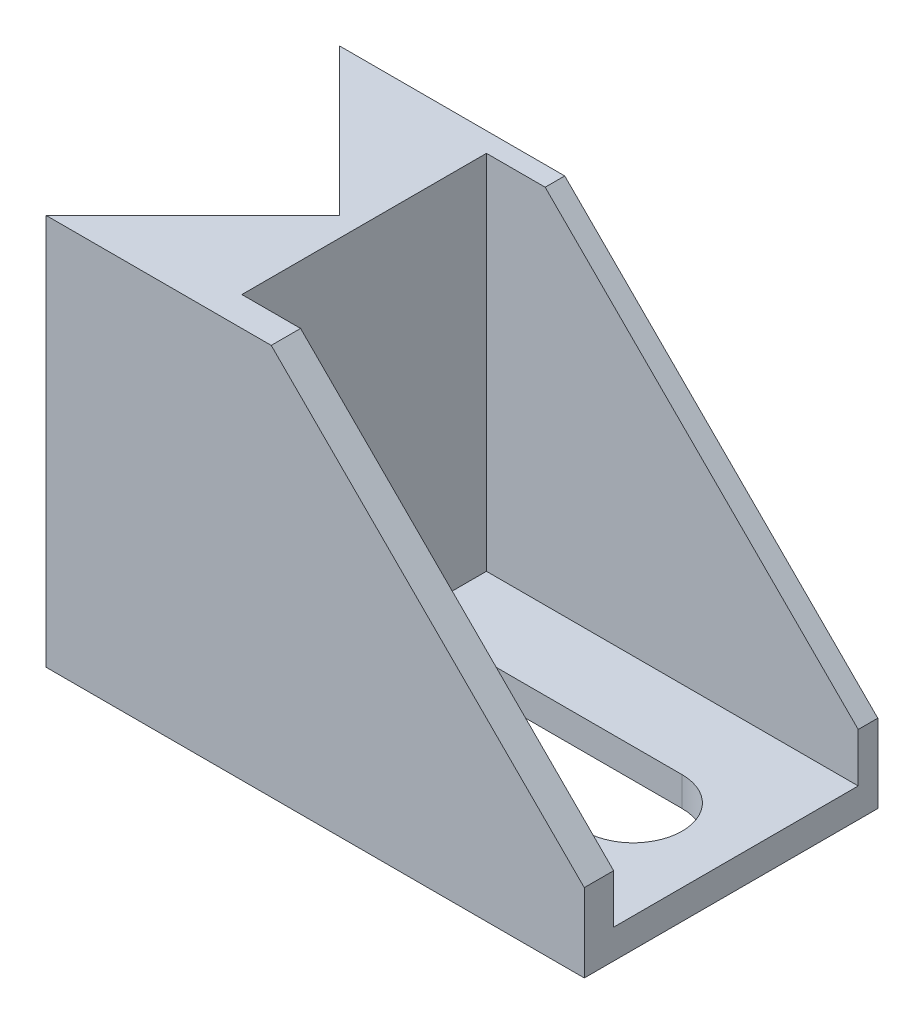
ISO-10303-21;
HEADER;
FILE_DESCRIPTION(('STEP AP214'),'2;1');
FILE_NAME('part.step','',(''),(''),'','','');
FILE_SCHEMA(('AUTOMOTIVE_DESIGN { 1 0 10303 214 1 1 1 1 }'));
ENDSEC;
DATA;
#1=APPLICATION_CONTEXT('core data for automotive mechanical design processes');
#2=APPLICATION_PROTOCOL_DEFINITION('international standard','automotive_design',2000,#1);
#3=PRODUCT_CONTEXT('',#1,'mechanical');
#4=PRODUCT('Part','Part','',(#3));
#5=PRODUCT_RELATED_PRODUCT_CATEGORY('part','',(#4));
#6=PRODUCT_DEFINITION_FORMATION('','',#4);
#7=PRODUCT_DEFINITION_CONTEXT('part definition',#1,'design');
#8=PRODUCT_DEFINITION('design','',#6,#7);
#9=PRODUCT_DEFINITION_SHAPE('','',#8);
#10=(LENGTH_UNIT() NAMED_UNIT(*) SI_UNIT(.MILLI.,.METRE.));
#11=(NAMED_UNIT(*) PLANE_ANGLE_UNIT() SI_UNIT($,.RADIAN.));
#12=(NAMED_UNIT(*) SI_UNIT($,.STERADIAN.) SOLID_ANGLE_UNIT());
#13=UNCERTAINTY_MEASURE_WITH_UNIT(LENGTH_MEASURE(1.E-05),#10,'distance_accuracy_value','');
#14=(GEOMETRIC_REPRESENTATION_CONTEXT(3) GLOBAL_UNCERTAINTY_ASSIGNED_CONTEXT((#13)) GLOBAL_UNIT_ASSIGNED_CONTEXT((#10,
#11,#12)) REPRESENTATION_CONTEXT('',''));
#15=CARTESIAN_POINT('',(0.,0.,0.));
#16=DIRECTION('',(0.,0.,1.));
#17=DIRECTION('',(1.,0.,0.));
#18=AXIS2_PLACEMENT_3D('',#15,#16,#17);
#19=CARTESIAN_POINT('',(25.4,5.08,19.05));
#20=DIRECTION('',(-0.707106781186547,-0.707106781186547,0.));
#21=DIRECTION('',(0.707106781186548,-0.707106781186548,0.));
#22=AXIS2_PLACEMENT_3D('',#19,#20,#21);
#23=PLANE('',#22);
#24=DIRECTION('',(0.,0.,-1.));
#25=VECTOR('',#24,1.);
#26=CARTESIAN_POINT('',(5.08,25.4,19.05));
#27=LINE('',#26,#25);
#28=CARTESIAN_POINT('',(5.08000000000001,25.4,1.27));
#29=VERTEX_POINT('',#28);
#30=CARTESIAN_POINT('',(5.08,25.4,0.));
#31=VERTEX_POINT('',#30);
#32=EDGE_CURVE('E242',#29,#31,#27,.T.);
#33=ORIENTED_EDGE('',*,*,#32,.F.);
#34=DIRECTION('',(0.707106781186547,-0.707106781186547,0.));
#35=VECTOR('',#34,1.);
#36=CARTESIAN_POINT('',(25.4,5.08,1.27));
#37=LINE('',#36,#35);
#38=CARTESIAN_POINT('',(25.4,5.08,1.27));
#39=VERTEX_POINT('',#38);
#40=EDGE_CURVE('E146',#29,#39,#37,.T.);
#41=ORIENTED_EDGE('',*,*,#40,.T.);
#42=DIRECTION('',(0.,0.,-1.));
#43=VECTOR('',#42,1.);
#44=CARTESIAN_POINT('',(25.4,5.08,19.05));
#45=LINE('',#44,#43);
#46=CARTESIAN_POINT('',(25.4,5.08,0.));
#47=VERTEX_POINT('',#46);
#48=EDGE_CURVE('E253',#39,#47,#45,.T.);
#49=ORIENTED_EDGE('',*,*,#48,.T.);
#50=DIRECTION('',(-0.707106781186547,0.707106781186547,0.));
#51=VECTOR('',#50,1.);
#52=CARTESIAN_POINT('',(25.4,5.08,0.));
#53=LINE('',#52,#51);
#54=EDGE_CURVE('E247',#47,#31,#53,.T.);
#55=ORIENTED_EDGE('',*,*,#54,.T.);
#56=EDGE_LOOP('',(#33,#41,#49,#55));
#57=FACE_BOUND('',#56,.T.);
#58=ADVANCED_FACE('F35',(#57),#23,.F.);
#59=CARTESIAN_POINT('',(25.4,5.08,19.05));
#60=VERTEX_POINT('',#59);
#61=CARTESIAN_POINT('',(25.4,5.08,17.145));
#62=VERTEX_POINT('',#61);
#63=EDGE_CURVE('E254',#60,#62,#45,.T.);
#64=ORIENTED_EDGE('',*,*,#63,.T.);
#65=DIRECTION('',(-0.707106781186548,0.707106781186548,0.));
#66=VECTOR('',#65,1.);
#67=CARTESIAN_POINT('',(25.4,5.08,17.145));
#68=LINE('',#67,#66);
#69=CARTESIAN_POINT('',(5.08000000000001,25.4,17.145));
#70=VERTEX_POINT('',#69);
#71=EDGE_CURVE('E230',#62,#70,#68,.T.);
#72=ORIENTED_EDGE('',*,*,#71,.T.);
#73=CARTESIAN_POINT('',(5.08,25.4,19.05));
#74=VERTEX_POINT('',#73);
#75=EDGE_CURVE('E251',#74,#70,#27,.T.);
#76=ORIENTED_EDGE('',*,*,#75,.F.);
#77=DIRECTION('',(-0.707106781186547,0.707106781186547,0.));
#78=VECTOR('',#77,1.);
#79=CARTESIAN_POINT('',(25.4,5.08,19.05));
#80=LINE('',#79,#78);
#81=EDGE_CURVE('E238',#60,#74,#80,.T.);
#82=ORIENTED_EDGE('',*,*,#81,.F.);
#83=EDGE_LOOP('',(#64,#72,#76,#82));
#84=FACE_BOUND('',#83,.T.);
#85=ADVANCED_FACE('F281',(#84),#23,.F.);
#86=CARTESIAN_POINT('',(0.,0.,19.05));
#87=DIRECTION('',(0.,1.,0.));
#88=DIRECTION('',(0.,0.,1.));
#89=AXIS2_PLACEMENT_3D('',#86,#87,#88);
#90=PLANE('',#89);
#91=CARTESIAN_POINT('',(19.05,0.,9.525));
#92=DIRECTION('',(0.,-1.,0.));
#93=DIRECTION('',(0.,0.,-1.));
#94=AXIS2_PLACEMENT_3D('',#91,#92,#93);
#95=CIRCLE('',#94,3.175);
#96=CARTESIAN_POINT('',(19.05,0.,6.35));
#97=VERTEX_POINT('',#96);
#98=CARTESIAN_POINT('',(19.05,0.,12.7));
#99=VERTEX_POINT('',#98);
#100=EDGE_CURVE('E203',#97,#99,#95,.T.);
#101=ORIENTED_EDGE('',*,*,#100,.F.);
#102=DIRECTION('',(1.,0.,0.));
#103=VECTOR('',#102,1.);
#104=CARTESIAN_POINT('',(6.35,0.,6.35));
#105=LINE('',#104,#103);
#106=CARTESIAN_POINT('',(6.35,0.,6.35));
#107=VERTEX_POINT('',#106);
#108=EDGE_CURVE('E206',#107,#97,#105,.T.);
#109=ORIENTED_EDGE('',*,*,#108,.F.);
#110=CARTESIAN_POINT('',(6.35,0.,9.525));
#111=DIRECTION('',(0.,-1.,0.));
#112=DIRECTION('',(0.,0.,-1.));
#113=AXIS2_PLACEMENT_3D('',#110,#111,#112);
#114=CIRCLE('',#113,3.175);
#115=CARTESIAN_POINT('',(6.35,0.,12.7));
#116=VERTEX_POINT('',#115);
#117=EDGE_CURVE('E200',#116,#107,#114,.T.);
#118=ORIENTED_EDGE('',*,*,#117,.F.);
#119=DIRECTION('',(-1.,0.,0.));
#120=VECTOR('',#119,1.);
#121=CARTESIAN_POINT('',(6.35,0.,12.7));
#122=LINE('',#121,#120);
#123=EDGE_CURVE('E50',#99,#116,#122,.T.);
#124=ORIENTED_EDGE('',*,*,#123,.F.);
#125=EDGE_LOOP('',(#101,#109,#118,#124));
#126=FACE_BOUND('',#125,.T.);
#127=DIRECTION('',(1.,0.,0.));
#128=VECTOR('',#127,1.);
#129=CARTESIAN_POINT('',(0.,0.,0.));
#130=LINE('',#129,#128);
#131=CARTESIAN_POINT('',(-9.525,0.,0.));
#132=VERTEX_POINT('',#131);
#133=CARTESIAN_POINT('',(25.4,0.,0.));
#134=VERTEX_POINT('',#133);
#135=EDGE_CURVE('E232',#132,#134,#130,.T.);
#136=ORIENTED_EDGE('',*,*,#135,.T.);
#137=DIRECTION('',(0.,0.,-1.));
#138=VECTOR('',#137,1.);
#139=CARTESIAN_POINT('',(25.4,0.,19.05));
#140=LINE('',#139,#138);
#141=CARTESIAN_POINT('',(25.4,0.,19.05));
#142=VERTEX_POINT('',#141);
#143=EDGE_CURVE('E43',#142,#134,#140,.T.);
#144=ORIENTED_EDGE('',*,*,#143,.F.);
#145=DIRECTION('',(1.,0.,0.));
#146=VECTOR('',#145,1.);
#147=CARTESIAN_POINT('',(0.,0.,19.05));
#148=LINE('',#147,#146);
#149=CARTESIAN_POINT('',(-9.525,0.,19.05));
#150=VERTEX_POINT('',#149);
#151=EDGE_CURVE('E233',#150,#142,#148,.T.);
#152=ORIENTED_EDGE('',*,*,#151,.F.);
#153=DIRECTION('',(-0.707106781186548,0.,0.707106781186548));
#154=VECTOR('',#153,1.);
#155=CARTESIAN_POINT('',(4.7625,0.,4.7625));
#156=LINE('',#155,#154);
#157=CARTESIAN_POINT('',(0.,0.,9.525));
#158=VERTEX_POINT('',#157);
#159=EDGE_CURVE('E180',#158,#150,#156,.T.);
#160=ORIENTED_EDGE('',*,*,#159,.F.);
#161=DIRECTION('',(0.707106781186548,0.,0.707106781186548));
#162=VECTOR('',#161,1.);
#163=CARTESIAN_POINT('',(-4.7625,0.,4.7625));
#164=LINE('',#163,#162);
#165=EDGE_CURVE('E195',#132,#158,#164,.T.);
#166=ORIENTED_EDGE('',*,*,#165,.F.);
#167=EDGE_LOOP('',(#136,#144,#152,#160,#166));
#168=FACE_BOUND('',#167,.T.);
#169=ADVANCED_FACE('F37',(#126,#168),#90,.F.);
#170=CARTESIAN_POINT('',(25.4,0.,19.05));
#171=DIRECTION('',(-1.,0.,0.));
#172=DIRECTION('',(0.,0.,1.));
#173=AXIS2_PLACEMENT_3D('',#170,#171,#172);
#174=PLANE('',#173);
#175=ORIENTED_EDGE('',*,*,#48,.F.);
#176=DIRECTION('',(0.,1.,0.));
#177=VECTOR('',#176,1.);
#178=CARTESIAN_POINT('',(25.4,-26.9787761554822,1.27));
#179=LINE('',#178,#177);
#180=CARTESIAN_POINT('',(25.4,1.905,1.27));
#181=VERTEX_POINT('',#180);
#182=EDGE_CURVE('E171',#181,#39,#179,.T.);
#183=ORIENTED_EDGE('',*,*,#182,.F.);
#184=DIRECTION('',(0.,0.,1.));
#185=VECTOR('',#184,1.);
#186=CARTESIAN_POINT('',(25.4,1.905,1.27));
#187=LINE('',#186,#185);
#188=CARTESIAN_POINT('',(25.4,1.905,17.145));
#189=VERTEX_POINT('',#188);
#190=EDGE_CURVE('E173',#181,#189,#187,.T.);
#191=ORIENTED_EDGE('',*,*,#190,.T.);
#192=DIRECTION('',(0.,1.,0.));
#193=VECTOR('',#192,1.);
#194=CARTESIAN_POINT('',(25.4,-26.9787761554822,17.145));
#195=LINE('',#194,#193);
#196=EDGE_CURVE('E174',#189,#62,#195,.T.);
#197=ORIENTED_EDGE('',*,*,#196,.T.);
#198=ORIENTED_EDGE('',*,*,#63,.F.);
#199=DIRECTION('',(0.,1.,0.));
#200=VECTOR('',#199,1.);
#201=CARTESIAN_POINT('',(25.4,0.,19.05));
#202=LINE('',#201,#200);
#203=EDGE_CURVE('E235',#142,#60,#202,.T.);
#204=ORIENTED_EDGE('',*,*,#203,.F.);
#205=ORIENTED_EDGE('',*,*,#143,.T.);
#206=DIRECTION('',(0.,1.,0.));
#207=VECTOR('',#206,1.);
#208=CARTESIAN_POINT('',(25.4,0.,0.));
#209=LINE('',#208,#207);
#210=EDGE_CURVE('E244',#134,#47,#209,.T.);
#211=ORIENTED_EDGE('',*,*,#210,.T.);
#212=EDGE_LOOP('',(#175,#183,#191,#197,#198,#204,#205,#211));
#213=FACE_BOUND('',#212,.T.);
#214=ADVANCED_FACE('F262',(#213),#174,.F.);
#215=CARTESIAN_POINT('',(5.08,25.4,19.05));
#216=DIRECTION('',(0.,-1.,0.));
#217=DIRECTION('',(0.,0.,-1.));
#218=AXIS2_PLACEMENT_3D('',#215,#216,#217);
#219=PLANE('',#218);
#220=DIRECTION('',(0.,0.,1.));
#221=VECTOR('',#220,1.);
#222=CARTESIAN_POINT('',(1.27,25.4,1.27));
#223=LINE('',#222,#221);
#224=CARTESIAN_POINT('',(1.27,25.4,1.27));
#225=VERTEX_POINT('',#224);
#226=CARTESIAN_POINT('',(1.27,25.4,17.145));
#227=VERTEX_POINT('',#226);
#228=EDGE_CURVE('E154',#225,#227,#223,.T.);
#229=ORIENTED_EDGE('',*,*,#228,.F.);
#230=DIRECTION('',(1.,0.,0.));
#231=VECTOR('',#230,1.);
#232=CARTESIAN_POINT('',(5.08,25.4,1.27));
#233=LINE('',#232,#231);
#234=EDGE_CURVE('E11',#225,#29,#233,.T.);
#235=ORIENTED_EDGE('',*,*,#234,.T.);
#236=ORIENTED_EDGE('',*,*,#32,.T.);
#237=DIRECTION('',(-1.,0.,0.));
#238=VECTOR('',#237,1.);
#239=CARTESIAN_POINT('',(5.08,25.4,0.));
#240=LINE('',#239,#238);
#241=CARTESIAN_POINT('',(-9.525,25.4,0.));
#242=VERTEX_POINT('',#241);
#243=EDGE_CURVE('E236',#31,#242,#240,.T.);
#244=ORIENTED_EDGE('',*,*,#243,.T.);
#245=DIRECTION('',(-0.707106781186548,0.,-0.707106781186548));
#246=VECTOR('',#245,1.);
#247=CARTESIAN_POINT('',(-4.7625,25.4,4.7625));
#248=LINE('',#247,#246);
#249=CARTESIAN_POINT('',(0.,25.4,9.525));
#250=VERTEX_POINT('',#249);
#251=EDGE_CURVE('E186',#250,#242,#248,.T.);
#252=ORIENTED_EDGE('',*,*,#251,.F.);
#253=DIRECTION('',(0.707106781186548,0.,-0.707106781186548));
#254=VECTOR('',#253,1.);
#255=CARTESIAN_POINT('',(4.7625,25.4,4.7625));
#256=LINE('',#255,#254);
#257=CARTESIAN_POINT('',(-9.525,25.4,19.05));
#258=VERTEX_POINT('',#257);
#259=EDGE_CURVE('E184',#258,#250,#256,.T.);
#260=ORIENTED_EDGE('',*,*,#259,.F.);
#261=DIRECTION('',(-1.,0.,0.));
#262=VECTOR('',#261,1.);
#263=CARTESIAN_POINT('',(5.08,25.4,19.05));
#264=LINE('',#263,#262);
#265=EDGE_CURVE('E240',#74,#258,#264,.T.);
#266=ORIENTED_EDGE('',*,*,#265,.F.);
#267=ORIENTED_EDGE('',*,*,#75,.T.);
#268=DIRECTION('',(1.,0.,0.));
#269=VECTOR('',#268,1.);
#270=CARTESIAN_POINT('',(25.4,25.4,17.145));
#271=LINE('',#270,#269);
#272=EDGE_CURVE('E160',#227,#70,#271,.T.);
#273=ORIENTED_EDGE('',*,*,#272,.F.);
#274=EDGE_LOOP('',(#229,#235,#236,#244,#252,#260,#266,#267,#273));
#275=FACE_BOUND('',#274,.T.);
#276=ADVANCED_FACE('F162',(#275),#219,.F.);
#277=CARTESIAN_POINT('',(0.,0.,19.05));
#278=DIRECTION('',(0.,0.,1.));
#279=DIRECTION('',(1.,0.,0.));
#280=AXIS2_PLACEMENT_3D('',#277,#278,#279);
#281=PLANE('',#280);
#282=ORIENTED_EDGE('',*,*,#265,.T.);
#283=DIRECTION('',(0.,1.,0.));
#284=VECTOR('',#283,1.);
#285=CARTESIAN_POINT('',(-9.525,-13.4703841816037,19.05));
#286=LINE('',#285,#284);
#287=EDGE_CURVE('E181',#150,#258,#286,.T.);
#288=ORIENTED_EDGE('',*,*,#287,.F.);
#289=ORIENTED_EDGE('',*,*,#151,.T.);
#290=ORIENTED_EDGE('',*,*,#203,.T.);
#291=ORIENTED_EDGE('',*,*,#81,.T.);
#292=EDGE_LOOP('',(#282,#288,#289,#290,#291));
#293=FACE_BOUND('',#292,.T.);
#294=ADVANCED_FACE('F285',(#293),#281,.T.);
#295=CARTESIAN_POINT('',(0.,0.,0.));
#296=DIRECTION('',(0.,0.,1.));
#297=DIRECTION('',(1.,0.,0.));
#298=AXIS2_PLACEMENT_3D('',#295,#296,#297);
#299=PLANE('',#298);
#300=ORIENTED_EDGE('',*,*,#135,.F.);
#301=DIRECTION('',(0.,1.,0.));
#302=VECTOR('',#301,1.);
#303=CARTESIAN_POINT('',(-9.525,-13.4703841816037,0.));
#304=LINE('',#303,#302);
#305=EDGE_CURVE('E191',#132,#242,#304,.T.);
#306=ORIENTED_EDGE('',*,*,#305,.T.);
#307=ORIENTED_EDGE('',*,*,#243,.F.);
#308=ORIENTED_EDGE('',*,*,#54,.F.);
#309=ORIENTED_EDGE('',*,*,#210,.F.);
#310=EDGE_LOOP('',(#300,#306,#307,#308,#309));
#311=FACE_BOUND('',#310,.T.);
#312=ADVANCED_FACE('F267',(#311),#299,.F.);
#313=CARTESIAN_POINT('',(0.,1.905,19.05));
#314=DIRECTION('',(0.,1.,0.));
#315=DIRECTION('',(0.,0.,1.));
#316=AXIS2_PLACEMENT_3D('',#313,#314,#315);
#317=PLANE('',#316);
#318=DIRECTION('',(1.,0.,0.));
#319=VECTOR('',#318,1.);
#320=CARTESIAN_POINT('',(6.35,1.905,6.35));
#321=LINE('',#320,#319);
#322=CARTESIAN_POINT('',(6.35,1.905,6.35));
#323=VERTEX_POINT('',#322);
#324=CARTESIAN_POINT('',(19.05,1.905,6.35));
#325=VERTEX_POINT('',#324);
#326=EDGE_CURVE('E202',#323,#325,#321,.T.);
#327=ORIENTED_EDGE('',*,*,#326,.T.);
#328=CARTESIAN_POINT('',(19.05,1.905,9.525));
#329=DIRECTION('',(0.,1.,0.));
#330=DIRECTION('',(0.,0.,1.));
#331=AXIS2_PLACEMENT_3D('',#328,#329,#330);
#332=CIRCLE('',#331,3.175);
#333=CARTESIAN_POINT('',(19.05,1.905,12.7));
#334=VERTEX_POINT('',#333);
#335=EDGE_CURVE('E221',#325,#334,#332,.F.);
#336=ORIENTED_EDGE('',*,*,#335,.T.);
#337=DIRECTION('',(-1.,0.,0.));
#338=VECTOR('',#337,1.);
#339=CARTESIAN_POINT('',(6.35,1.905,12.7));
#340=LINE('',#339,#338);
#341=CARTESIAN_POINT('',(6.35,1.905,12.7));
#342=VERTEX_POINT('',#341);
#343=EDGE_CURVE('E217',#334,#342,#340,.T.);
#344=ORIENTED_EDGE('',*,*,#343,.T.);
#345=CARTESIAN_POINT('',(6.35,1.905,9.525));
#346=DIRECTION('',(0.,1.,0.));
#347=DIRECTION('',(0.,0.,1.));
#348=AXIS2_PLACEMENT_3D('',#345,#346,#347);
#349=CIRCLE('',#348,3.175);
#350=EDGE_CURVE('E213',#342,#323,#349,.F.);
#351=ORIENTED_EDGE('',*,*,#350,.T.);
#352=EDGE_LOOP('',(#327,#336,#344,#351));
#353=FACE_BOUND('',#352,.T.);
#354=DIRECTION('',(1.,0.,0.));
#355=VECTOR('',#354,1.);
#356=CARTESIAN_POINT('',(0.,1.905,17.145));
#357=LINE('',#356,#355);
#358=CARTESIAN_POINT('',(1.27,1.905,17.145));
#359=VERTEX_POINT('',#358);
#360=EDGE_CURVE('E228',#359,#189,#357,.T.);
#361=ORIENTED_EDGE('',*,*,#360,.T.);
#362=ORIENTED_EDGE('',*,*,#190,.F.);
#363=DIRECTION('',(1.,0.,0.));
#364=VECTOR('',#363,1.);
#365=CARTESIAN_POINT('',(25.4,1.905,1.27));
#366=LINE('',#365,#364);
#367=CARTESIAN_POINT('',(1.27,1.905,1.27));
#368=VERTEX_POINT('',#367);
#369=EDGE_CURVE('E168',#368,#181,#366,.T.);
#370=ORIENTED_EDGE('',*,*,#369,.F.);
#371=DIRECTION('',(0.,0.,-1.));
#372=VECTOR('',#371,1.);
#373=CARTESIAN_POINT('',(1.27,1.905,1.27));
#374=LINE('',#373,#372);
#375=EDGE_CURVE('E157',#359,#368,#374,.T.);
#376=ORIENTED_EDGE('',*,*,#375,.F.);
#377=EDGE_LOOP('',(#361,#362,#370,#376));
#378=FACE_BOUND('',#377,.T.);
#379=ADVANCED_FACE('F275',(#353,#378),#317,.T.);
#380=CARTESIAN_POINT('',(0.,0.,17.145));
#381=DIRECTION('',(0.,0.,1.));
#382=DIRECTION('',(1.,0.,0.));
#383=AXIS2_PLACEMENT_3D('',#380,#381,#382);
#384=PLANE('',#383);
#385=ORIENTED_EDGE('',*,*,#360,.F.);
#386=DIRECTION('',(0.,1.,0.));
#387=VECTOR('',#386,1.);
#388=CARTESIAN_POINT('',(1.27,-26.9787761554822,17.145));
#389=LINE('',#388,#387);
#390=EDGE_CURVE('E159',#359,#227,#389,.T.);
#391=ORIENTED_EDGE('',*,*,#390,.T.);
#392=ORIENTED_EDGE('',*,*,#272,.T.);
#393=ORIENTED_EDGE('',*,*,#71,.F.);
#394=ORIENTED_EDGE('',*,*,#196,.F.);
#395=EDGE_LOOP('',(#385,#391,#392,#393,#394));
#396=FACE_BOUND('',#395,.T.);
#397=ADVANCED_FACE('F278',(#396),#384,.F.);
#398=CARTESIAN_POINT('',(6.35,21.9854631420692,6.35));
#399=DIRECTION('',(0.,0.,-1.));
#400=DIRECTION('',(-1.,0.,0.));
#401=AXIS2_PLACEMENT_3D('',#398,#399,#400);
#402=PLANE('',#401);
#403=DIRECTION('',(0.,-1.,0.));
#404=VECTOR('',#403,1.);
#405=CARTESIAN_POINT('',(6.35,21.9854631420692,6.35));
#406=LINE('',#405,#404);
#407=EDGE_CURVE('E58',#323,#107,#406,.T.);
#408=ORIENTED_EDGE('',*,*,#407,.T.);
#409=ORIENTED_EDGE('',*,*,#108,.T.);
#410=DIRECTION('',(0.,-1.,0.));
#411=VECTOR('',#410,1.);
#412=CARTESIAN_POINT('',(19.05,21.9854631420692,6.35));
#413=LINE('',#412,#411);
#414=EDGE_CURVE('E212',#325,#97,#413,.T.);
#415=ORIENTED_EDGE('',*,*,#414,.F.);
#416=ORIENTED_EDGE('',*,*,#326,.F.);
#417=EDGE_LOOP('',(#408,#409,#415,#416));
#418=FACE_BOUND('',#417,.T.);
#419=ADVANCED_FACE('F328',(#418),#402,.F.);
#420=CARTESIAN_POINT('',(19.05,21.9854631420692,9.525));
#421=DIRECTION('',(0.,-1.,0.));
#422=DIRECTION('',(0.,0.,-1.));
#423=AXIS2_PLACEMENT_3D('',#420,#421,#422);
#424=CYLINDRICAL_SURFACE('',#423,3.175);
#425=ORIENTED_EDGE('',*,*,#414,.T.);
#426=ORIENTED_EDGE('',*,*,#100,.T.);
#427=DIRECTION('',(0.,-1.,0.));
#428=VECTOR('',#427,1.);
#429=CARTESIAN_POINT('',(19.05,21.9854631420692,12.7));
#430=LINE('',#429,#428);
#431=EDGE_CURVE('E220',#334,#99,#430,.T.);
#432=ORIENTED_EDGE('',*,*,#431,.F.);
#433=ORIENTED_EDGE('',*,*,#335,.F.);
#434=EDGE_LOOP('',(#425,#426,#432,#433));
#435=FACE_BOUND('',#434,.T.);
#436=ADVANCED_FACE('F325',(#435),#424,.F.);
#437=CARTESIAN_POINT('',(6.35,21.9854631420692,12.7));
#438=DIRECTION('',(0.,0.,1.));
#439=DIRECTION('',(1.,0.,0.));
#440=AXIS2_PLACEMENT_3D('',#437,#438,#439);
#441=PLANE('',#440);
#442=ORIENTED_EDGE('',*,*,#431,.T.);
#443=ORIENTED_EDGE('',*,*,#123,.T.);
#444=DIRECTION('',(0.,-1.,0.));
#445=VECTOR('',#444,1.);
#446=CARTESIAN_POINT('',(6.35,21.9854631420692,12.7));
#447=LINE('',#446,#445);
#448=EDGE_CURVE('E216',#342,#116,#447,.T.);
#449=ORIENTED_EDGE('',*,*,#448,.F.);
#450=ORIENTED_EDGE('',*,*,#343,.F.);
#451=EDGE_LOOP('',(#442,#443,#449,#450));
#452=FACE_BOUND('',#451,.T.);
#453=ADVANCED_FACE('F303',(#452),#441,.F.);
#454=CARTESIAN_POINT('',(6.35,21.9854631420692,9.525));
#455=DIRECTION('',(0.,-1.,0.));
#456=DIRECTION('',(0.,0.,-1.));
#457=AXIS2_PLACEMENT_3D('',#454,#455,#456);
#458=CYLINDRICAL_SURFACE('',#457,3.175);
#459=ORIENTED_EDGE('',*,*,#448,.T.);
#460=ORIENTED_EDGE('',*,*,#117,.T.);
#461=ORIENTED_EDGE('',*,*,#407,.F.);
#462=ORIENTED_EDGE('',*,*,#350,.F.);
#463=EDGE_LOOP('',(#459,#460,#461,#462));
#464=FACE_BOUND('',#463,.T.);
#465=ADVANCED_FACE('F296',(#464),#458,.F.);
#466=CARTESIAN_POINT('',(-4.7625,-13.4703841816037,4.7625));
#467=DIRECTION('',(0.707106781186548,0.,-0.707106781186548));
#468=DIRECTION('',(-0.707106781186548,0.,-0.707106781186548));
#469=AXIS2_PLACEMENT_3D('',#466,#467,#468);
#470=PLANE('',#469);
#471=ORIENTED_EDGE('',*,*,#305,.F.);
#472=ORIENTED_EDGE('',*,*,#165,.T.);
#473=DIRECTION('',(0.,1.,0.));
#474=VECTOR('',#473,1.);
#475=CARTESIAN_POINT('',(0.,-13.4703841816037,9.525));
#476=LINE('',#475,#474);
#477=EDGE_CURVE('E192',#158,#250,#476,.T.);
#478=ORIENTED_EDGE('',*,*,#477,.T.);
#479=ORIENTED_EDGE('',*,*,#251,.T.);
#480=EDGE_LOOP('',(#471,#472,#478,#479));
#481=FACE_BOUND('',#480,.T.);
#482=ADVANCED_FACE('F294',(#481),#470,.F.);
#483=CARTESIAN_POINT('',(4.7625,-13.4703841816037,4.7625));
#484=DIRECTION('',(0.707106781186548,0.,0.707106781186548));
#485=DIRECTION('',(0.707106781186548,0.,-0.707106781186548));
#486=AXIS2_PLACEMENT_3D('',#483,#484,#485);
#487=PLANE('',#486);
#488=ORIENTED_EDGE('',*,*,#477,.F.);
#489=ORIENTED_EDGE('',*,*,#159,.T.);
#490=ORIENTED_EDGE('',*,*,#287,.T.);
#491=ORIENTED_EDGE('',*,*,#259,.T.);
#492=EDGE_LOOP('',(#488,#489,#490,#491));
#493=FACE_BOUND('',#492,.T.);
#494=ADVANCED_FACE('F289',(#493),#487,.F.);
#495=CARTESIAN_POINT('',(25.4,-26.9787761554822,1.27));
#496=DIRECTION('',(0.,0.,-1.));
#497=DIRECTION('',(-1.,0.,0.));
#498=AXIS2_PLACEMENT_3D('',#495,#496,#497);
#499=PLANE('',#498);
#500=ORIENTED_EDGE('',*,*,#234,.F.);
#501=DIRECTION('',(0.,1.,0.));
#502=VECTOR('',#501,1.);
#503=CARTESIAN_POINT('',(1.27,-26.9787761554822,1.27));
#504=LINE('',#503,#502);
#505=EDGE_CURVE('E144',#368,#225,#504,.T.);
#506=ORIENTED_EDGE('',*,*,#505,.F.);
#507=ORIENTED_EDGE('',*,*,#369,.T.);
#508=ORIENTED_EDGE('',*,*,#182,.T.);
#509=ORIENTED_EDGE('',*,*,#40,.F.);
#510=EDGE_LOOP('',(#500,#506,#507,#508,#509));
#511=FACE_BOUND('',#510,.T.);
#512=ADVANCED_FACE('F143',(#511),#499,.F.);
#513=CARTESIAN_POINT('',(1.27,-26.9787761554822,1.27));
#514=DIRECTION('',(-1.,0.,0.));
#515=DIRECTION('',(0.,0.,1.));
#516=AXIS2_PLACEMENT_3D('',#513,#514,#515);
#517=PLANE('',#516);
#518=ORIENTED_EDGE('',*,*,#375,.T.);
#519=ORIENTED_EDGE('',*,*,#505,.T.);
#520=ORIENTED_EDGE('',*,*,#228,.T.);
#521=ORIENTED_EDGE('',*,*,#390,.F.);
#522=EDGE_LOOP('',(#518,#519,#520,#521));
#523=FACE_BOUND('',#522,.T.);
#524=ADVANCED_FACE('F152',(#523),#517,.F.);
#525=CLOSED_SHELL('',(#58,#85,#169,#214,#276,#294,#312,#379,#397,#419,#436,#453,#465,#482,#494,
#512,#524));
#526=MANIFOLD_SOLID_BREP('B2',#525);
#527=ADVANCED_BREP_SHAPE_REPRESENTATION('',(#18,#526),#14);
#528=SHAPE_DEFINITION_REPRESENTATION(#9,#527);
ENDSEC;
END-ISO-10303-21;
